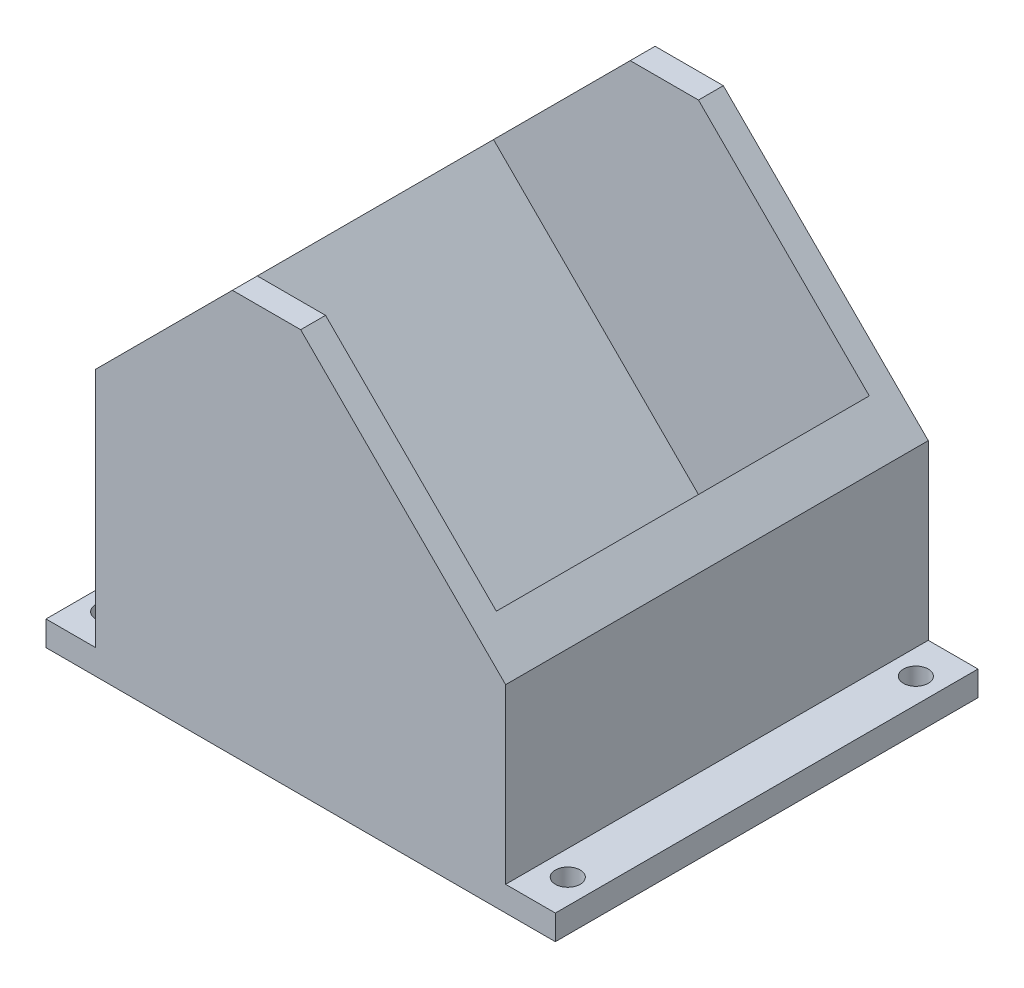
ISO-10303-21;
HEADER;
FILE_DESCRIPTION(('STEP AP214'),'2;1');
FILE_NAME('part.step','',(''),(''),'','','');
FILE_SCHEMA(('AUTOMOTIVE_DESIGN { 1 0 10303 214 1 1 1 1 }'));
ENDSEC;
DATA;
#1=APPLICATION_CONTEXT('core data for automotive mechanical design processes');
#2=APPLICATION_PROTOCOL_DEFINITION('international standard','automotive_design',2000,#1);
#3=PRODUCT_CONTEXT('',#1,'mechanical');
#4=PRODUCT('Part','Part','',(#3));
#5=PRODUCT_RELATED_PRODUCT_CATEGORY('part','',(#4));
#6=PRODUCT_DEFINITION_FORMATION('','',#4);
#7=PRODUCT_DEFINITION_CONTEXT('part definition',#1,'design');
#8=PRODUCT_DEFINITION('design','',#6,#7);
#9=PRODUCT_DEFINITION_SHAPE('','',#8);
#10=(LENGTH_UNIT() NAMED_UNIT(*) SI_UNIT(.MILLI.,.METRE.));
#11=(NAMED_UNIT(*) PLANE_ANGLE_UNIT() SI_UNIT($,.RADIAN.));
#12=(NAMED_UNIT(*) SI_UNIT($,.STERADIAN.) SOLID_ANGLE_UNIT());
#13=UNCERTAINTY_MEASURE_WITH_UNIT(LENGTH_MEASURE(1.E-05),#10,'distance_accuracy_value','');
#14=(GEOMETRIC_REPRESENTATION_CONTEXT(3) GLOBAL_UNCERTAINTY_ASSIGNED_CONTEXT((#13)) GLOBAL_UNIT_ASSIGNED_CONTEXT((#10,
#11,#12)) REPRESENTATION_CONTEXT('',''));
#15=CARTESIAN_POINT('',(0.,0.,0.));
#16=DIRECTION('',(0.,0.,1.));
#17=DIRECTION('',(1.,0.,0.));
#18=AXIS2_PLACEMENT_3D('',#15,#16,#17);
#19=CARTESIAN_POINT('',(-97.,0.,150.));
#20=DIRECTION('',(1.,0.,0.));
#21=DIRECTION('',(0.,0.,-1.));
#22=AXIS2_PLACEMENT_3D('',#19,#20,#21);
#23=PLANE('',#22);
#24=DIRECTION('',(0.,0.,-1.));
#25=VECTOR('',#24,1.);
#26=CARTESIAN_POINT('',(-97.,10.,-10.));
#27=LINE('',#26,#25);
#28=CARTESIAN_POINT('',(-97.,9.99999999999999,160.));
#29=VERTEX_POINT('',#28);
#30=CARTESIAN_POINT('',(-97.,10.,-10.));
#31=VERTEX_POINT('',#30);
#32=EDGE_CURVE('E250',#29,#31,#27,.T.);
#33=ORIENTED_EDGE('',*,*,#32,.F.);
#34=DIRECTION('',(0.,-1.,0.));
#35=VECTOR('',#34,1.);
#36=CARTESIAN_POINT('',(-97.,106.999999999999,160.));
#37=LINE('',#36,#35);
#38=CARTESIAN_POINT('',(-97.,106.999999999999,160.));
#39=VERTEX_POINT('',#38);
#40=EDGE_CURVE('E309',#39,#29,#37,.T.);
#41=ORIENTED_EDGE('',*,*,#40,.F.);
#42=DIRECTION('',(0.,0.,1.));
#43=VECTOR('',#42,1.);
#44=CARTESIAN_POINT('',(-97.,106.999999999999,150.));
#45=LINE('',#44,#43);
#46=CARTESIAN_POINT('',(-97.,106.999999999999,150.));
#47=VERTEX_POINT('',#46);
#48=EDGE_CURVE('E300',#47,#39,#45,.T.);
#49=ORIENTED_EDGE('',*,*,#48,.F.);
#50=DIRECTION('',(0.,0.,-1.));
#51=VECTOR('',#50,1.);
#52=CARTESIAN_POINT('',(-97.,106.999999999999,150.));
#53=LINE('',#52,#51);
#54=CARTESIAN_POINT('',(-97.,106.999999999999,0.));
#55=VERTEX_POINT('',#54);
#56=EDGE_CURVE('E48',#47,#55,#53,.T.);
#57=ORIENTED_EDGE('',*,*,#56,.T.);
#58=DIRECTION('',(0.,0.,1.));
#59=VECTOR('',#58,1.);
#60=CARTESIAN_POINT('',(-97.,106.999999999999,0.));
#61=LINE('',#60,#59);
#62=CARTESIAN_POINT('',(-97.,106.999999999999,-10.));
#63=VERTEX_POINT('',#62);
#64=EDGE_CURVE('E288',#63,#55,#61,.T.);
#65=ORIENTED_EDGE('',*,*,#64,.F.);
#66=DIRECTION('',(0.,-1.,0.));
#67=VECTOR('',#66,1.);
#68=CARTESIAN_POINT('',(-97.,106.999999999999,-10.));
#69=LINE('',#68,#67);
#70=EDGE_CURVE('E292',#63,#31,#69,.T.);
#71=ORIENTED_EDGE('',*,*,#70,.T.);
#72=EDGE_LOOP('',(#33,#41,#49,#57,#65,#71));
#73=FACE_BOUND('',#72,.T.);
#74=ADVANCED_FACE('F39',(#73),#23,.F.);
#75=CARTESIAN_POINT('',(-97.,106.999999999999,150.));
#76=DIRECTION('',(-0.707106781186544,-0.707106781186552,0.));
#77=DIRECTION('',(0.707106781186552,-0.707106781186544,0.));
#78=AXIS2_PLACEMENT_3D('',#75,#76,#77);
#79=PLANE('',#78);
#80=DIRECTION('',(-0.707106781186552,0.707106781186544,0.));
#81=VECTOR('',#80,1.);
#82=CARTESIAN_POINT('',(-97.,106.999999999999,150.));
#83=LINE('',#82,#81);
#84=CARTESIAN_POINT('',(-14.5663996924429,24.5663996924428,150.));
#85=VERTEX_POINT('',#84);
#86=EDGE_CURVE('E324',#85,#47,#83,.T.);
#87=ORIENTED_EDGE('',*,*,#86,.F.);
#88=DIRECTION('',(0.,0.,1.));
#89=VECTOR('',#88,1.);
#90=CARTESIAN_POINT('',(-14.5663996924429,24.5663996924429,-135.07145686512));
#91=LINE('',#90,#89);
#92=CARTESIAN_POINT('',(-14.5663996924429,24.5663996924429,0.));
#93=VERTEX_POINT('',#92);
#94=EDGE_CURVE('E319',#93,#85,#91,.T.);
#95=ORIENTED_EDGE('',*,*,#94,.F.);
#96=DIRECTION('',(-0.707106781186552,0.707106781186544,0.));
#97=VECTOR('',#96,1.);
#98=CARTESIAN_POINT('',(-97.,106.999999999999,0.));
#99=LINE('',#98,#97);
#100=EDGE_CURVE('E323',#93,#55,#99,.T.);
#101=ORIENTED_EDGE('',*,*,#100,.T.);
#102=ORIENTED_EDGE('',*,*,#56,.F.);
#103=EDGE_LOOP('',(#87,#95,#101,#102));
#104=FACE_BOUND('',#103,.T.);
#105=ADVANCED_FACE('F41',(#104),#79,.F.);
#106=CARTESIAN_POINT('',(0.,0.,150.));
#107=DIRECTION('',(0.,1.,0.));
#108=DIRECTION('',(-1.,0.,0.));
#109=AXIS2_PLACEMENT_3D('',#106,#107,#108);
#110=PLANE('',#109);
#111=DIRECTION('',(1.,0.,0.));
#112=VECTOR('',#111,1.);
#113=CARTESIAN_POINT('',(-97.,0.,160.));
#114=LINE('',#113,#112);
#115=CARTESIAN_POINT('',(-117.,0.,160.));
#116=VERTEX_POINT('',#115);
#117=CARTESIAN_POINT('',(87.8672006151143,0.,160.));
#118=VERTEX_POINT('',#117);
#119=EDGE_CURVE('E299',#116,#118,#114,.T.);
#120=ORIENTED_EDGE('',*,*,#119,.F.);
#121=DIRECTION('',(0.,0.,1.));
#122=VECTOR('',#121,1.);
#123=CARTESIAN_POINT('',(-117.,0.,-9.99999999999999));
#124=LINE('',#123,#122);
#125=CARTESIAN_POINT('',(-117.,0.,-9.99999999999999));
#126=VERTEX_POINT('',#125);
#127=EDGE_CURVE('E246',#126,#116,#124,.T.);
#128=ORIENTED_EDGE('',*,*,#127,.F.);
#129=DIRECTION('',(-1.,0.,0.));
#130=VECTOR('',#129,1.);
#131=CARTESIAN_POINT('',(-97.,0.,-10.));
#132=LINE('',#131,#130);
#133=CARTESIAN_POINT('',(87.8672006151143,0.,-9.99999999999999));
#134=VERTEX_POINT('',#133);
#135=EDGE_CURVE('E285',#134,#126,#132,.T.);
#136=ORIENTED_EDGE('',*,*,#135,.F.);
#137=DIRECTION('',(0.,0.,-1.));
#138=VECTOR('',#137,1.);
#139=CARTESIAN_POINT('',(87.8672006151143,0.,-9.99999999999999));
#140=LINE('',#139,#138);
#141=EDGE_CURVE('E204',#118,#134,#140,.T.);
#142=ORIENTED_EDGE('',*,*,#141,.F.);
#143=EDGE_LOOP('',(#120,#128,#136,#142));
#144=FACE_BOUND('',#143,.T.);
#145=CARTESIAN_POINT('',(-107.,0.,145.));
#146=DIRECTION('',(0.,1.,0.));
#147=DIRECTION('',(0.,0.,1.));
#148=AXIS2_PLACEMENT_3D('',#145,#146,#147);
#149=CIRCLE('',#148,5.00000000000001);
#150=CARTESIAN_POINT('',(-107.,0.,150.));
#151=VERTEX_POINT('',#150);
#152=EDGE_CURVE('E238',#151,#151,#149,.T.);
#153=ORIENTED_EDGE('',*,*,#152,.T.);
#154=EDGE_LOOP('',(#153));
#155=FACE_BOUND('',#154,.T.);
#156=CARTESIAN_POINT('',(-107.,0.,5.00000000000001));
#157=DIRECTION('',(0.,1.,0.));
#158=DIRECTION('',(0.,0.,1.));
#159=AXIS2_PLACEMENT_3D('',#156,#157,#158);
#160=CIRCLE('',#159,5.);
#161=CARTESIAN_POINT('',(-107.,0.,10.));
#162=VERTEX_POINT('',#161);
#163=EDGE_CURVE('E233',#162,#162,#160,.T.);
#164=ORIENTED_EDGE('',*,*,#163,.T.);
#165=EDGE_LOOP('',(#164));
#166=FACE_BOUND('',#165,.T.);
#167=CARTESIAN_POINT('',(77.8672006151143,0.,145.));
#168=DIRECTION('',(0.,1.,0.));
#169=DIRECTION('',(0.,0.,-1.));
#170=AXIS2_PLACEMENT_3D('',#167,#168,#169);
#171=CIRCLE('',#170,5.00000000000001);
#172=CARTESIAN_POINT('',(77.8672006151143,0.,140.));
#173=VERTEX_POINT('',#172);
#174=EDGE_CURVE('E196',#173,#173,#171,.T.);
#175=ORIENTED_EDGE('',*,*,#174,.T.);
#176=EDGE_LOOP('',(#175));
#177=FACE_BOUND('',#176,.T.);
#178=CARTESIAN_POINT('',(77.8672006151143,0.,5.00000000000001));
#179=DIRECTION('',(0.,1.,0.));
#180=DIRECTION('',(0.,0.,-1.));
#181=AXIS2_PLACEMENT_3D('',#178,#179,#180);
#182=CIRCLE('',#181,5.);
#183=CARTESIAN_POINT('',(77.8672006151143,0.,0.));
#184=VERTEX_POINT('',#183);
#185=EDGE_CURVE('E191',#184,#184,#182,.T.);
#186=ORIENTED_EDGE('',*,*,#185,.T.);
#187=EDGE_LOOP('',(#186));
#188=FACE_BOUND('',#187,.T.);
#189=ADVANCED_FACE('F385',(#144,#155,#166,#177,#188),#110,.F.);
#190=CARTESIAN_POINT('',(67.8672006151156,106.999999999999,-135.07145686512));
#191=DIRECTION('',(1.,0.,0.));
#192=DIRECTION('',(0.,1.,0.));
#193=AXIS2_PLACEMENT_3D('',#190,#191,#192);
#194=PLANE('',#193);
#195=DIRECTION('',(0.,0.,1.));
#196=VECTOR('',#195,1.);
#197=CARTESIAN_POINT('',(67.8672006151156,79.5463996924412,-10.));
#198=LINE('',#197,#196);
#199=CARTESIAN_POINT('',(67.8672006151156,79.5463996924412,-10.));
#200=VERTEX_POINT('',#199);
#201=CARTESIAN_POINT('',(67.8672006151156,79.5463996924412,160.));
#202=VERTEX_POINT('',#201);
#203=EDGE_CURVE('E151',#200,#202,#198,.T.);
#204=ORIENTED_EDGE('',*,*,#203,.T.);
#205=DIRECTION('',(0.,-1.,0.));
#206=VECTOR('',#205,1.);
#207=CARTESIAN_POINT('',(67.8672006151156,106.999999999999,160.));
#208=LINE('',#207,#206);
#209=CARTESIAN_POINT('',(67.8672006151143,10.,160.));
#210=VERTEX_POINT('',#209);
#211=EDGE_CURVE('E304',#202,#210,#208,.T.);
#212=ORIENTED_EDGE('',*,*,#211,.T.);
#213=DIRECTION('',(0.,0.,1.));
#214=VECTOR('',#213,1.);
#215=CARTESIAN_POINT('',(67.8672006151143,10.,-10.));
#216=LINE('',#215,#214);
#217=CARTESIAN_POINT('',(67.8672006151156,9.99999999999999,-10.));
#218=VERTEX_POINT('',#217);
#219=EDGE_CURVE('E208',#218,#210,#216,.T.);
#220=ORIENTED_EDGE('',*,*,#219,.F.);
#221=DIRECTION('',(0.,-1.,0.));
#222=VECTOR('',#221,1.);
#223=CARTESIAN_POINT('',(67.8672006151156,106.999999999999,-10.));
#224=LINE('',#223,#222);
#225=EDGE_CURVE('E62',#200,#218,#224,.T.);
#226=ORIENTED_EDGE('',*,*,#225,.F.);
#227=EDGE_LOOP('',(#204,#212,#220,#226));
#228=FACE_BOUND('',#227,.T.);
#229=ADVANCED_FACE('F397',(#228),#194,.T.);
#230=CARTESIAN_POINT('',(-14.5663996924429,24.5663996924429,-135.07145686512));
#231=DIRECTION('',(-0.707106781186537,0.707106781186558,0.));
#232=DIRECTION('',(-0.707106781186558,-0.707106781186537,0.));
#233=AXIS2_PLACEMENT_3D('',#230,#231,#232);
#234=PLANE('',#233);
#235=DIRECTION('',(0.,0.,1.));
#236=VECTOR('',#235,1.);
#237=CARTESIAN_POINT('',(54.1404004613366,93.2731998462203,-135.07145686512));
#238=LINE('',#237,#236);
#239=CARTESIAN_POINT('',(54.1404004613366,93.2731998462203,0.));
#240=VERTEX_POINT('',#239);
#241=CARTESIAN_POINT('',(54.1404004613366,93.2731998462203,150.));
#242=VERTEX_POINT('',#241);
#243=EDGE_CURVE('E351',#240,#242,#238,.T.);
#244=ORIENTED_EDGE('',*,*,#243,.F.);
#245=DIRECTION('',(-0.707106781186558,-0.707106781186537,0.));
#246=VECTOR('',#245,1.);
#247=CARTESIAN_POINT('',(-14.5663996924429,24.5663996924429,0.));
#248=LINE('',#247,#246);
#249=EDGE_CURVE('E316',#240,#93,#248,.T.);
#250=ORIENTED_EDGE('',*,*,#249,.T.);
#251=ORIENTED_EDGE('',*,*,#94,.T.);
#252=DIRECTION('',(-0.707106781186558,-0.707106781186537,0.));
#253=VECTOR('',#252,1.);
#254=CARTESIAN_POINT('',(-14.5663996924429,24.5663996924429,150.));
#255=LINE('',#254,#253);
#256=EDGE_CURVE('E313',#242,#85,#255,.T.);
#257=ORIENTED_EDGE('',*,*,#256,.F.);
#258=EDGE_LOOP('',(#244,#250,#251,#257));
#259=FACE_BOUND('',#258,.T.);
#260=ADVANCED_FACE('F350',(#259),#234,.T.);
#261=CARTESIAN_POINT('',(-97.,106.999999999999,150.));
#262=DIRECTION('',(0.,0.,1.));
#263=DIRECTION('',(1.,0.,0.));
#264=AXIS2_PLACEMENT_3D('',#261,#262,#263);
#265=PLANE('',#264);
#266=DIRECTION('',(1.,0.,0.));
#267=VECTOR('',#266,1.);
#268=CARTESIAN_POINT('',(-97.,161.979999999999,150.));
#269=LINE('',#268,#267);
#270=CARTESIAN_POINT('',(-42.0199999999991,161.979999999999,150.));
#271=VERTEX_POINT('',#270);
#272=CARTESIAN_POINT('',(-14.5663996924421,161.979999999999,150.));
#273=VERTEX_POINT('',#272);
#274=EDGE_CURVE('E187',#271,#273,#269,.T.);
#275=ORIENTED_EDGE('',*,*,#274,.T.);
#276=DIRECTION('',(0.707106781186548,-0.707106781186548,0.));
#277=VECTOR('',#276,1.);
#278=CARTESIAN_POINT('',(-28.293199846221,175.706800153778,150.));
#279=LINE('',#278,#277);
#280=EDGE_CURVE('E55',#273,#242,#279,.T.);
#281=ORIENTED_EDGE('',*,*,#280,.T.);
#282=ORIENTED_EDGE('',*,*,#256,.T.);
#283=ORIENTED_EDGE('',*,*,#86,.T.);
#284=DIRECTION('',(0.707106781186551,0.707106781186544,0.));
#285=VECTOR('',#284,1.);
#286=CARTESIAN_POINT('',(-97.,106.999999999999,150.));
#287=LINE('',#286,#285);
#288=EDGE_CURVE('E281',#47,#271,#287,.T.);
#289=ORIENTED_EDGE('',*,*,#288,.T.);
#290=EDGE_LOOP('',(#275,#281,#282,#283,#289));
#291=FACE_BOUND('',#290,.T.);
#292=ADVANCED_FACE('F361',(#291),#265,.F.);
#293=CARTESIAN_POINT('',(-97.,106.999999999999,160.));
#294=DIRECTION('',(0.,0.,-1.));
#295=DIRECTION('',(-1.,0.,0.));
#296=AXIS2_PLACEMENT_3D('',#293,#294,#295);
#297=PLANE('',#296);
#298=ORIENTED_EDGE('',*,*,#211,.F.);
#299=DIRECTION('',(-0.707106781186548,0.707106781186548,0.));
#300=VECTOR('',#299,1.);
#301=CARTESIAN_POINT('',(-28.293199846221,175.706800153778,160.));
#302=LINE('',#301,#300);
#303=CARTESIAN_POINT('',(-14.5663996924421,161.979999999999,160.));
#304=VERTEX_POINT('',#303);
#305=EDGE_CURVE('E170',#202,#304,#302,.T.);
#306=ORIENTED_EDGE('',*,*,#305,.T.);
#307=DIRECTION('',(-1.,0.,0.));
#308=VECTOR('',#307,1.);
#309=CARTESIAN_POINT('',(-97.,161.979999999999,160.));
#310=LINE('',#309,#308);
#311=CARTESIAN_POINT('',(-42.0199999999991,161.979999999999,160.));
#312=VERTEX_POINT('',#311);
#313=EDGE_CURVE('E184',#304,#312,#310,.T.);
#314=ORIENTED_EDGE('',*,*,#313,.T.);
#315=DIRECTION('',(-0.707106781186551,-0.707106781186544,0.));
#316=VECTOR('',#315,1.);
#317=CARTESIAN_POINT('',(-97.,106.999999999999,160.));
#318=LINE('',#317,#316);
#319=EDGE_CURVE('E278',#312,#39,#318,.T.);
#320=ORIENTED_EDGE('',*,*,#319,.T.);
#321=ORIENTED_EDGE('',*,*,#40,.T.);
#322=DIRECTION('',(1.,0.,0.));
#323=VECTOR('',#322,1.);
#324=CARTESIAN_POINT('',(-97.,10.,160.));
#325=LINE('',#324,#323);
#326=CARTESIAN_POINT('',(-117.,10.,160.));
#327=VERTEX_POINT('',#326);
#328=EDGE_CURVE('E260',#327,#29,#325,.T.);
#329=ORIENTED_EDGE('',*,*,#328,.F.);
#330=DIRECTION('',(0.,-1.,0.));
#331=VECTOR('',#330,1.);
#332=CARTESIAN_POINT('',(-117.,10.,160.));
#333=LINE('',#332,#331);
#334=EDGE_CURVE('E264',#327,#116,#333,.T.);
#335=ORIENTED_EDGE('',*,*,#334,.T.);
#336=ORIENTED_EDGE('',*,*,#119,.T.);
#337=DIRECTION('',(0.,-1.,0.));
#338=VECTOR('',#337,1.);
#339=CARTESIAN_POINT('',(87.8672006151143,10.,160.));
#340=LINE('',#339,#338);
#341=CARTESIAN_POINT('',(87.8672006151143,10.,160.));
#342=VERTEX_POINT('',#341);
#343=EDGE_CURVE('E229',#342,#118,#340,.T.);
#344=ORIENTED_EDGE('',*,*,#343,.F.);
#345=DIRECTION('',(1.,0.,0.));
#346=VECTOR('',#345,1.);
#347=CARTESIAN_POINT('',(67.8672006151143,10.,160.));
#348=LINE('',#347,#346);
#349=EDGE_CURVE('E212',#210,#342,#348,.T.);
#350=ORIENTED_EDGE('',*,*,#349,.F.);
#351=EDGE_LOOP('',(#298,#306,#314,#320,#321,#329,#335,#336,#344,#350));
#352=FACE_BOUND('',#351,.T.);
#353=ADVANCED_FACE('F371',(#352),#297,.F.);
#354=CARTESIAN_POINT('',(-97.,106.999999999999,0.));
#355=DIRECTION('',(0.,0.,-1.));
#356=DIRECTION('',(-1.,0.,0.));
#357=AXIS2_PLACEMENT_3D('',#354,#355,#356);
#358=PLANE('',#357);
#359=ORIENTED_EDGE('',*,*,#249,.F.);
#360=DIRECTION('',(-0.707106781186548,0.707106781186548,0.));
#361=VECTOR('',#360,1.);
#362=CARTESIAN_POINT('',(-28.293199846221,175.706800153778,0.));
#363=LINE('',#362,#361);
#364=CARTESIAN_POINT('',(-14.5663996924421,161.979999999999,0.));
#365=VERTEX_POINT('',#364);
#366=EDGE_CURVE('E352',#240,#365,#363,.T.);
#367=ORIENTED_EDGE('',*,*,#366,.T.);
#368=DIRECTION('',(-1.,0.,0.));
#369=VECTOR('',#368,1.);
#370=CARTESIAN_POINT('',(-97.,161.979999999999,0.));
#371=LINE('',#370,#369);
#372=CARTESIAN_POINT('',(-42.0199999999991,161.979999999999,0.));
#373=VERTEX_POINT('',#372);
#374=EDGE_CURVE('E161',#365,#373,#371,.T.);
#375=ORIENTED_EDGE('',*,*,#374,.T.);
#376=DIRECTION('',(-0.707106781186551,-0.707106781186544,0.));
#377=VECTOR('',#376,1.);
#378=CARTESIAN_POINT('',(-97.,106.999999999999,0.));
#379=LINE('',#378,#377);
#380=EDGE_CURVE('E275',#373,#55,#379,.T.);
#381=ORIENTED_EDGE('',*,*,#380,.T.);
#382=ORIENTED_EDGE('',*,*,#100,.F.);
#383=EDGE_LOOP('',(#359,#367,#375,#381,#382));
#384=FACE_BOUND('',#383,.T.);
#385=ADVANCED_FACE('F345',(#384),#358,.F.);
#386=CARTESIAN_POINT('',(-97.,106.999999999999,-10.));
#387=DIRECTION('',(0.,0.,1.));
#388=DIRECTION('',(1.,0.,0.));
#389=AXIS2_PLACEMENT_3D('',#386,#387,#388);
#390=PLANE('',#389);
#391=DIRECTION('',(1.,0.,0.));
#392=VECTOR('',#391,1.);
#393=CARTESIAN_POINT('',(-42.0199999999991,161.979999999999,-10.));
#394=LINE('',#393,#392);
#395=CARTESIAN_POINT('',(-42.0199999999991,161.979999999999,-10.));
#396=VERTEX_POINT('',#395);
#397=CARTESIAN_POINT('',(-14.5663996924421,161.979999999999,-10.));
#398=VERTEX_POINT('',#397);
#399=EDGE_CURVE('E159',#396,#398,#394,.T.);
#400=ORIENTED_EDGE('',*,*,#399,.T.);
#401=DIRECTION('',(0.707106781186547,-0.707106781186547,0.));
#402=VECTOR('',#401,1.);
#403=CARTESIAN_POINT('',(-14.5663996924421,161.979999999999,-10.));
#404=LINE('',#403,#402);
#405=EDGE_CURVE('E145',#398,#200,#404,.T.);
#406=ORIENTED_EDGE('',*,*,#405,.T.);
#407=ORIENTED_EDGE('',*,*,#225,.T.);
#408=DIRECTION('',(-1.,0.,0.));
#409=VECTOR('',#408,1.);
#410=CARTESIAN_POINT('',(67.8672006151143,10.,-10.));
#411=LINE('',#410,#409);
#412=CARTESIAN_POINT('',(87.8672006151143,10.,-9.99999999999999));
#413=VERTEX_POINT('',#412);
#414=EDGE_CURVE('E218',#413,#218,#411,.T.);
#415=ORIENTED_EDGE('',*,*,#414,.F.);
#416=DIRECTION('',(0.,-1.,0.));
#417=VECTOR('',#416,1.);
#418=CARTESIAN_POINT('',(87.8672006151143,10.,-9.99999999999999));
#419=LINE('',#418,#417);
#420=EDGE_CURVE('E222',#413,#134,#419,.T.);
#421=ORIENTED_EDGE('',*,*,#420,.T.);
#422=ORIENTED_EDGE('',*,*,#135,.T.);
#423=DIRECTION('',(0.,-1.,0.));
#424=VECTOR('',#423,1.);
#425=CARTESIAN_POINT('',(-117.,10.,-9.99999999999999));
#426=LINE('',#425,#424);
#427=CARTESIAN_POINT('',(-117.,10.,-9.99999999999999));
#428=VERTEX_POINT('',#427);
#429=EDGE_CURVE('E271',#428,#126,#426,.T.);
#430=ORIENTED_EDGE('',*,*,#429,.F.);
#431=DIRECTION('',(-1.,0.,0.));
#432=VECTOR('',#431,1.);
#433=CARTESIAN_POINT('',(-97.,10.,-10.));
#434=LINE('',#433,#432);
#435=EDGE_CURVE('E254',#31,#428,#434,.T.);
#436=ORIENTED_EDGE('',*,*,#435,.F.);
#437=ORIENTED_EDGE('',*,*,#70,.F.);
#438=DIRECTION('',(0.707106781186551,0.707106781186544,0.));
#439=VECTOR('',#438,1.);
#440=CARTESIAN_POINT('',(-97.,106.999999999999,-10.));
#441=LINE('',#440,#439);
#442=EDGE_CURVE('E167',#63,#396,#441,.T.);
#443=ORIENTED_EDGE('',*,*,#442,.T.);
#444=EDGE_LOOP('',(#400,#406,#407,#415,#421,#422,#430,#436,#437,#443));
#445=FACE_BOUND('',#444,.T.);
#446=ADVANCED_FACE('F165',(#445),#390,.F.);
#447=CARTESIAN_POINT('',(-97.,106.999999999999,-34.3271339177464));
#448=DIRECTION('',(-0.707106781186544,0.707106781186551,0.));
#449=DIRECTION('',(-0.707106781186551,-0.707106781186544,0.));
#450=AXIS2_PLACEMENT_3D('',#447,#448,#449);
#451=PLANE('',#450);
#452=DIRECTION('',(0.,0.,1.));
#453=VECTOR('',#452,1.);
#454=CARTESIAN_POINT('',(-42.0199999999991,161.979999999999,-10.));
#455=LINE('',#454,#453);
#456=EDGE_CURVE('E169',#271,#312,#455,.T.);
#457=ORIENTED_EDGE('',*,*,#456,.F.);
#458=ORIENTED_EDGE('',*,*,#288,.F.);
#459=ORIENTED_EDGE('',*,*,#48,.T.);
#460=ORIENTED_EDGE('',*,*,#319,.F.);
#461=EDGE_LOOP('',(#457,#458,#459,#460));
#462=FACE_BOUND('',#461,.T.);
#463=ADVANCED_FACE('F368',(#462),#451,.T.);
#464=CARTESIAN_POINT('',(-97.,106.999999999999,184.327133917746));
#465=DIRECTION('',(-0.707106781186544,0.707106781186551,0.));
#466=DIRECTION('',(-0.707106781186551,-0.707106781186544,0.));
#467=AXIS2_PLACEMENT_3D('',#464,#465,#466);
#468=PLANE('',#467);
#469=EDGE_CURVE('E175',#396,#373,#455,.T.);
#470=ORIENTED_EDGE('',*,*,#469,.F.);
#471=ORIENTED_EDGE('',*,*,#442,.F.);
#472=ORIENTED_EDGE('',*,*,#64,.T.);
#473=ORIENTED_EDGE('',*,*,#380,.F.);
#474=EDGE_LOOP('',(#470,#471,#472,#473));
#475=FACE_BOUND('',#474,.T.);
#476=ADVANCED_FACE('F341',(#475),#468,.T.);
#477=CARTESIAN_POINT('',(0.,10.,0.));
#478=DIRECTION('',(0.,-1.,0.));
#479=DIRECTION('',(0.,0.,-1.));
#480=AXIS2_PLACEMENT_3D('',#477,#478,#479);
#481=PLANE('',#480);
#482=ORIENTED_EDGE('',*,*,#32,.T.);
#483=ORIENTED_EDGE('',*,*,#435,.T.);
#484=DIRECTION('',(0.,0.,1.));
#485=VECTOR('',#484,1.);
#486=CARTESIAN_POINT('',(-117.,10.,-9.99999999999999));
#487=LINE('',#486,#485);
#488=EDGE_CURVE('E257',#428,#327,#487,.T.);
#489=ORIENTED_EDGE('',*,*,#488,.T.);
#490=ORIENTED_EDGE('',*,*,#328,.T.);
#491=EDGE_LOOP('',(#482,#483,#489,#490));
#492=FACE_BOUND('',#491,.T.);
#493=CARTESIAN_POINT('',(-107.,10.,145.));
#494=DIRECTION('',(0.,1.,0.));
#495=DIRECTION('',(0.,0.,1.));
#496=AXIS2_PLACEMENT_3D('',#493,#494,#495);
#497=CIRCLE('',#496,5.00000000000001);
#498=CARTESIAN_POINT('',(-107.,10.,150.));
#499=VERTEX_POINT('',#498);
#500=EDGE_CURVE('E242',#499,#499,#497,.T.);
#501=ORIENTED_EDGE('',*,*,#500,.F.);
#502=EDGE_LOOP('',(#501));
#503=FACE_BOUND('',#502,.T.);
#504=CARTESIAN_POINT('',(-107.,10.,5.00000000000001));
#505=DIRECTION('',(0.,1.,0.));
#506=DIRECTION('',(0.,0.,1.));
#507=AXIS2_PLACEMENT_3D('',#504,#505,#506);
#508=CIRCLE('',#507,5.);
#509=CARTESIAN_POINT('',(-107.,10.,10.));
#510=VERTEX_POINT('',#509);
#511=EDGE_CURVE('E234',#510,#510,#508,.T.);
#512=ORIENTED_EDGE('',*,*,#511,.F.);
#513=EDGE_LOOP('',(#512));
#514=FACE_BOUND('',#513,.T.);
#515=ADVANCED_FACE('F375',(#492,#503,#514),#481,.F.);
#516=CARTESIAN_POINT('',(-117.,10.,-9.99999999999999));
#517=DIRECTION('',(1.,0.,0.));
#518=DIRECTION('',(0.,0.,-1.));
#519=AXIS2_PLACEMENT_3D('',#516,#517,#518);
#520=PLANE('',#519);
#521=ORIENTED_EDGE('',*,*,#127,.T.);
#522=ORIENTED_EDGE('',*,*,#334,.F.);
#523=ORIENTED_EDGE('',*,*,#488,.F.);
#524=ORIENTED_EDGE('',*,*,#429,.T.);
#525=EDGE_LOOP('',(#521,#522,#523,#524));
#526=FACE_BOUND('',#525,.T.);
#527=ADVANCED_FACE('F382',(#526),#520,.F.);
#528=CARTESIAN_POINT('',(-107.,10.,145.));
#529=DIRECTION('',(0.,-1.,0.));
#530=DIRECTION('',(0.,0.,-1.));
#531=AXIS2_PLACEMENT_3D('',#528,#529,#530);
#532=CYLINDRICAL_SURFACE('',#531,5.00000000000001);
#533=ORIENTED_EDGE('',*,*,#500,.T.);
#534=EDGE_LOOP('',(#533));
#535=FACE_BOUND('',#534,.T.);
#536=ORIENTED_EDGE('',*,*,#152,.F.);
#537=EDGE_LOOP('',(#536));
#538=FACE_BOUND('',#537,.T.);
#539=ADVANCED_FACE('F439',(#535,#538),#532,.F.);
#540=CARTESIAN_POINT('',(-107.,10.,5.00000000000001));
#541=DIRECTION('',(0.,-1.,0.));
#542=DIRECTION('',(0.,0.,-1.));
#543=AXIS2_PLACEMENT_3D('',#540,#541,#542);
#544=CYLINDRICAL_SURFACE('',#543,5.);
#545=ORIENTED_EDGE('',*,*,#511,.T.);
#546=EDGE_LOOP('',(#545));
#547=FACE_BOUND('',#546,.T.);
#548=ORIENTED_EDGE('',*,*,#163,.F.);
#549=EDGE_LOOP('',(#548));
#550=FACE_BOUND('',#549,.T.);
#551=ADVANCED_FACE('F448',(#547,#550),#544,.F.);
#552=CARTESIAN_POINT('',(0.,10.,0.));
#553=DIRECTION('',(0.,1.,0.));
#554=DIRECTION('',(0.,0.,1.));
#555=AXIS2_PLACEMENT_3D('',#552,#553,#554);
#556=PLANE('',#555);
#557=CARTESIAN_POINT('',(77.8672006151143,10.,145.));
#558=DIRECTION('',(0.,1.,0.));
#559=DIRECTION('',(0.,0.,-1.));
#560=AXIS2_PLACEMENT_3D('',#557,#558,#559);
#561=CIRCLE('',#560,5.00000000000001);
#562=CARTESIAN_POINT('',(77.8672006151143,10.,140.));
#563=VERTEX_POINT('',#562);
#564=EDGE_CURVE('E200',#563,#563,#561,.T.);
#565=ORIENTED_EDGE('',*,*,#564,.F.);
#566=EDGE_LOOP('',(#565));
#567=FACE_BOUND('',#566,.T.);
#568=ORIENTED_EDGE('',*,*,#219,.T.);
#569=ORIENTED_EDGE('',*,*,#349,.T.);
#570=DIRECTION('',(0.,0.,-1.));
#571=VECTOR('',#570,1.);
#572=CARTESIAN_POINT('',(87.8672006151143,10.,-9.99999999999999));
#573=LINE('',#572,#571);
#574=EDGE_CURVE('E215',#342,#413,#573,.T.);
#575=ORIENTED_EDGE('',*,*,#574,.T.);
#576=ORIENTED_EDGE('',*,*,#414,.T.);
#577=EDGE_LOOP('',(#568,#569,#575,#576));
#578=FACE_BOUND('',#577,.T.);
#579=CARTESIAN_POINT('',(77.8672006151143,10.,5.00000000000001));
#580=DIRECTION('',(0.,1.,0.));
#581=DIRECTION('',(0.,0.,-1.));
#582=AXIS2_PLACEMENT_3D('',#579,#580,#581);
#583=CIRCLE('',#582,5.);
#584=CARTESIAN_POINT('',(77.8672006151143,10.,0.));
#585=VERTEX_POINT('',#584);
#586=EDGE_CURVE('E192',#585,#585,#583,.T.);
#587=ORIENTED_EDGE('',*,*,#586,.F.);
#588=EDGE_LOOP('',(#587));
#589=FACE_BOUND('',#588,.T.);
#590=ADVANCED_FACE('F393',(#567,#578,#589),#556,.T.);
#591=CARTESIAN_POINT('',(87.8672006151143,10.,-9.99999999999999));
#592=DIRECTION('',(-1.,0.,0.));
#593=DIRECTION('',(0.,0.,1.));
#594=AXIS2_PLACEMENT_3D('',#591,#592,#593);
#595=PLANE('',#594);
#596=ORIENTED_EDGE('',*,*,#141,.T.);
#597=ORIENTED_EDGE('',*,*,#420,.F.);
#598=ORIENTED_EDGE('',*,*,#574,.F.);
#599=ORIENTED_EDGE('',*,*,#343,.T.);
#600=EDGE_LOOP('',(#596,#597,#598,#599));
#601=FACE_BOUND('',#600,.T.);
#602=ADVANCED_FACE('F390',(#601),#595,.F.);
#603=CARTESIAN_POINT('',(77.8672006151143,10.,145.));
#604=DIRECTION('',(0.,-1.,0.));
#605=DIRECTION('',(0.,0.,-1.));
#606=AXIS2_PLACEMENT_3D('',#603,#604,#605);
#607=CYLINDRICAL_SURFACE('',#606,5.00000000000001);
#608=ORIENTED_EDGE('',*,*,#564,.T.);
#609=EDGE_LOOP('',(#608));
#610=FACE_BOUND('',#609,.T.);
#611=ORIENTED_EDGE('',*,*,#174,.F.);
#612=EDGE_LOOP('',(#611));
#613=FACE_BOUND('',#612,.T.);
#614=ADVANCED_FACE('F476',(#610,#613),#607,.F.);
#615=CARTESIAN_POINT('',(77.8672006151143,10.,5.00000000000001));
#616=DIRECTION('',(0.,-1.,0.));
#617=DIRECTION('',(0.,0.,-1.));
#618=AXIS2_PLACEMENT_3D('',#615,#616,#617);
#619=CYLINDRICAL_SURFACE('',#618,5.);
#620=ORIENTED_EDGE('',*,*,#586,.T.);
#621=EDGE_LOOP('',(#620));
#622=FACE_BOUND('',#621,.T.);
#623=ORIENTED_EDGE('',*,*,#185,.F.);
#624=EDGE_LOOP('',(#623));
#625=FACE_BOUND('',#624,.T.);
#626=ADVANCED_FACE('F485',(#622,#625),#619,.F.);
#627=CARTESIAN_POINT('',(-42.0199999999991,161.979999999999,-10.));
#628=DIRECTION('',(0.,-1.,0.));
#629=DIRECTION('',(0.,0.,-1.));
#630=AXIS2_PLACEMENT_3D('',#627,#628,#629);
#631=PLANE('',#630);
#632=ORIENTED_EDGE('',*,*,#374,.F.);
#633=DIRECTION('',(0.,0.,1.));
#634=VECTOR('',#633,1.);
#635=CARTESIAN_POINT('',(-14.5663996924421,161.979999999999,-10.));
#636=LINE('',#635,#634);
#637=EDGE_CURVE('E148',#398,#365,#636,.T.);
#638=ORIENTED_EDGE('',*,*,#637,.F.);
#639=ORIENTED_EDGE('',*,*,#399,.F.);
#640=ORIENTED_EDGE('',*,*,#469,.T.);
#641=EDGE_LOOP('',(#632,#638,#639,#640));
#642=FACE_BOUND('',#641,.T.);
#643=ADVANCED_FACE('F157',(#642),#631,.F.);
#644=ORIENTED_EDGE('',*,*,#313,.F.);
#645=DIRECTION('',(0.,0.,-1.));
#646=VECTOR('',#645,1.);
#647=CARTESIAN_POINT('',(-14.5663996924421,161.979999999999,-10.));
#648=LINE('',#647,#646);
#649=EDGE_CURVE('E11',#304,#273,#648,.T.);
#650=ORIENTED_EDGE('',*,*,#649,.T.);
#651=ORIENTED_EDGE('',*,*,#274,.F.);
#652=ORIENTED_EDGE('',*,*,#456,.T.);
#653=EDGE_LOOP('',(#644,#650,#651,#652));
#654=FACE_BOUND('',#653,.T.);
#655=ADVANCED_FACE('F365',(#654),#631,.F.);
#656=CARTESIAN_POINT('',(-14.5663996924421,161.979999999999,-10.));
#657=DIRECTION('',(-0.707106781186547,-0.707106781186547,0.));
#658=DIRECTION('',(0.707106781186548,-0.707106781186548,0.));
#659=AXIS2_PLACEMENT_3D('',#656,#657,#658);
#660=PLANE('',#659);
#661=ORIENTED_EDGE('',*,*,#203,.F.);
#662=ORIENTED_EDGE('',*,*,#405,.F.);
#663=ORIENTED_EDGE('',*,*,#637,.T.);
#664=ORIENTED_EDGE('',*,*,#366,.F.);
#665=ORIENTED_EDGE('',*,*,#243,.T.);
#666=ORIENTED_EDGE('',*,*,#280,.F.);
#667=ORIENTED_EDGE('',*,*,#649,.F.);
#668=ORIENTED_EDGE('',*,*,#305,.F.);
#669=EDGE_LOOP('',(#661,#662,#663,#664,#665,#666,#667,#668));
#670=FACE_BOUND('',#669,.T.);
#671=ADVANCED_FACE('F147',(#670),#660,.F.);
#672=CLOSED_SHELL('',(#74,#105,#189,#229,#260,#292,#353,#385,#446,#463,#476,#515,#527,#539,#551,
#590,#602,#614,#626,#643,#655,#671));
#673=MANIFOLD_SOLID_BREP('B2',#672);
#674=ADVANCED_BREP_SHAPE_REPRESENTATION('',(#18,#673),#14);
#675=SHAPE_DEFINITION_REPRESENTATION(#9,#674);
ENDSEC;
END-ISO-10303-21;
